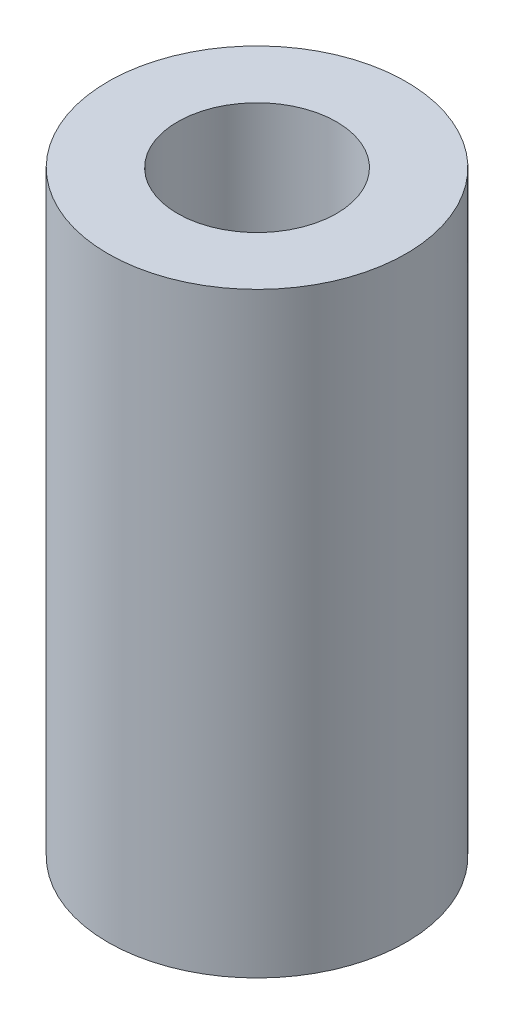
ISO-10303-21;
HEADER;
FILE_DESCRIPTION(('STEP AP214'),'2;1');
FILE_NAME('part.step','',(''),(''),'','','');
FILE_SCHEMA(('AUTOMOTIVE_DESIGN { 1 0 10303 214 1 1 1 1 }'));
ENDSEC;
DATA;
#1=APPLICATION_CONTEXT('core data for automotive mechanical design processes');
#2=APPLICATION_PROTOCOL_DEFINITION('international standard','automotive_design',2000,#1);
#3=PRODUCT_CONTEXT('',#1,'mechanical');
#4=PRODUCT('Part','Part','',(#3));
#5=PRODUCT_RELATED_PRODUCT_CATEGORY('part','',(#4));
#6=PRODUCT_DEFINITION_FORMATION('','',#4);
#7=PRODUCT_DEFINITION_CONTEXT('part definition',#1,'design');
#8=PRODUCT_DEFINITION('design','',#6,#7);
#9=PRODUCT_DEFINITION_SHAPE('','',#8);
#10=(LENGTH_UNIT() NAMED_UNIT(*) SI_UNIT(.MILLI.,.METRE.));
#11=(NAMED_UNIT(*) PLANE_ANGLE_UNIT() SI_UNIT($,.RADIAN.));
#12=(NAMED_UNIT(*) SI_UNIT($,.STERADIAN.) SOLID_ANGLE_UNIT());
#13=UNCERTAINTY_MEASURE_WITH_UNIT(LENGTH_MEASURE(1.E-05),#10,'distance_accuracy_value','');
#14=(GEOMETRIC_REPRESENTATION_CONTEXT(3) GLOBAL_UNCERTAINTY_ASSIGNED_CONTEXT((#13)) GLOBAL_UNIT_ASSIGNED_CONTEXT((#10,
#11,#12)) REPRESENTATION_CONTEXT('',''));
#15=CARTESIAN_POINT('',(0.,0.,0.));
#16=DIRECTION('',(0.,0.,1.));
#17=DIRECTION('',(1.,0.,0.));
#18=AXIS2_PLACEMENT_3D('',#15,#16,#17);
#19=CARTESIAN_POINT('',(0.,30.,0.));
#20=DIRECTION('',(0.,1.,0.));
#21=DIRECTION('',(0.,0.,1.));
#22=AXIS2_PLACEMENT_3D('',#19,#20,#21);
#23=PLANE('',#22);
#24=CARTESIAN_POINT('',(0.,30.,0.));
#25=DIRECTION('',(0.,1.,0.));
#26=DIRECTION('',(0.,0.,1.));
#27=AXIS2_PLACEMENT_3D('',#24,#25,#26);
#28=CIRCLE('',#27,7.5);
#29=CARTESIAN_POINT('',(0.,30.,7.5));
#30=VERTEX_POINT('',#29);
#31=EDGE_CURVE('E123',#30,#30,#28,.T.);
#32=ORIENTED_EDGE('',*,*,#31,.T.);
#33=EDGE_LOOP('',(#32));
#34=FACE_BOUND('',#33,.T.);
#35=CARTESIAN_POINT('',(0.,30.,0.));
#36=DIRECTION('',(0.,1.,0.));
#37=DIRECTION('',(0.,0.,1.));
#38=AXIS2_PLACEMENT_3D('',#35,#36,#37);
#39=CIRCLE('',#38,4.);
#40=CARTESIAN_POINT('',(0.,30.,4.));
#41=VERTEX_POINT('',#40);
#42=EDGE_CURVE('E113',#41,#41,#39,.T.);
#43=ORIENTED_EDGE('',*,*,#42,.F.);
#44=EDGE_LOOP('',(#43));
#45=FACE_BOUND('',#44,.T.);
#46=ADVANCED_FACE('F45',(#34,#45),#23,.T.);
#47=CARTESIAN_POINT('',(0.,0.,0.));
#48=DIRECTION('',(0.,1.,0.));
#49=DIRECTION('',(0.,0.,1.));
#50=AXIS2_PLACEMENT_3D('',#47,#48,#49);
#51=PLANE('',#50);
#52=DIRECTION('',(1.,0.,0.));
#53=VECTOR('',#52,1.);
#54=CARTESIAN_POINT('',(3.45,0.,2.9));
#55=LINE('',#54,#53);
#56=CARTESIAN_POINT('',(-2.75499546279118,0.,2.9));
#57=VERTEX_POINT('',#56);
#58=CARTESIAN_POINT('',(2.75499546279118,0.,2.9));
#59=VERTEX_POINT('',#58);
#60=EDGE_CURVE('E67',#57,#59,#55,.T.);
#61=ORIENTED_EDGE('',*,*,#60,.T.);
#62=CARTESIAN_POINT('',(0.,0.,0.));
#63=DIRECTION('',(0.,1.,0.));
#64=DIRECTION('',(0.,0.,1.));
#65=AXIS2_PLACEMENT_3D('',#62,#63,#64);
#66=CIRCLE('',#65,4.);
#67=EDGE_CURVE('E108',#59,#57,#66,.T.);
#68=ORIENTED_EDGE('',*,*,#67,.T.);
#69=EDGE_LOOP('',(#61,#68));
#70=FACE_BOUND('',#69,.T.);
#71=CARTESIAN_POINT('',(0.,0.,0.));
#72=DIRECTION('',(0.,1.,0.));
#73=DIRECTION('',(0.,0.,1.));
#74=AXIS2_PLACEMENT_3D('',#71,#72,#73);
#75=CIRCLE('',#74,7.5);
#76=CARTESIAN_POINT('',(0.,0.,7.5));
#77=VERTEX_POINT('',#76);
#78=EDGE_CURVE('E121',#77,#77,#75,.T.);
#79=ORIENTED_EDGE('',*,*,#78,.F.);
#80=EDGE_LOOP('',(#79));
#81=FACE_BOUND('',#80,.T.);
#82=ADVANCED_FACE('F143',(#70,#81),#51,.F.);
#83=CARTESIAN_POINT('',(0.,30.,0.));
#84=DIRECTION('',(0.,-1.,0.));
#85=DIRECTION('',(0.,0.,-1.));
#86=AXIS2_PLACEMENT_3D('',#83,#84,#85);
#87=CYLINDRICAL_SURFACE('',#86,7.5);
#88=ORIENTED_EDGE('',*,*,#31,.F.);
#89=EDGE_LOOP('',(#88));
#90=FACE_BOUND('',#89,.T.);
#91=ORIENTED_EDGE('',*,*,#78,.T.);
#92=EDGE_LOOP('',(#91));
#93=FACE_BOUND('',#92,.T.);
#94=ADVANCED_FACE('F47',(#90,#93),#87,.T.);
#95=CARTESIAN_POINT('',(0.,30.,0.));
#96=DIRECTION('',(0.,-1.,0.));
#97=DIRECTION('',(0.,0.,-1.));
#98=AXIS2_PLACEMENT_3D('',#95,#96,#97);
#99=CYLINDRICAL_SURFACE('',#98,4.);
#100=DIRECTION('',(0.,-1.,0.));
#101=VECTOR('',#100,1.);
#102=CARTESIAN_POINT('',(2.75499546279118,30.,2.9));
#103=LINE('',#102,#101);
#104=CARTESIAN_POINT('',(2.75499546279118,20.,2.9));
#105=VERTEX_POINT('',#104);
#106=EDGE_CURVE('E90',#105,#59,#103,.T.);
#107=ORIENTED_EDGE('',*,*,#106,.F.);
#108=CARTESIAN_POINT('',(0.,20.,0.));
#109=DIRECTION('',(0.,1.,0.));
#110=DIRECTION('',(0.,0.,1.));
#111=AXIS2_PLACEMENT_3D('',#108,#109,#110);
#112=CIRCLE('',#111,4.);
#113=CARTESIAN_POINT('',(-2.75499546279118,20.,2.9));
#114=VERTEX_POINT('',#113);
#115=EDGE_CURVE('E127',#114,#105,#112,.T.);
#116=ORIENTED_EDGE('',*,*,#115,.F.);
#117=DIRECTION('',(0.,-1.,0.));
#118=VECTOR('',#117,1.);
#119=CARTESIAN_POINT('',(-2.75499546279118,30.,2.9));
#120=LINE('',#119,#118);
#121=EDGE_CURVE('E103',#57,#114,#120,.F.);
#122=ORIENTED_EDGE('',*,*,#121,.F.);
#123=ORIENTED_EDGE('',*,*,#67,.F.);
#124=EDGE_LOOP('',(#107,#116,#122,#123));
#125=FACE_BOUND('',#124,.T.);
#126=ORIENTED_EDGE('',*,*,#42,.T.);
#127=EDGE_LOOP('',(#126));
#128=FACE_BOUND('',#127,.T.);
#129=ADVANCED_FACE('F141',(#125,#128),#99,.F.);
#130=CARTESIAN_POINT('',(0.,20.,0.));
#131=DIRECTION('',(0.,1.,0.));
#132=DIRECTION('',(0.,0.,1.));
#133=AXIS2_PLACEMENT_3D('',#130,#131,#132);
#134=PLANE('',#133);
#135=CARTESIAN_POINT('',(0.,20.,0.));
#136=DIRECTION('',(0.,1.,0.));
#137=DIRECTION('',(0.,0.,1.));
#138=AXIS2_PLACEMENT_3D('',#135,#136,#137);
#139=CIRCLE('',#138,3.925);
#140=CARTESIAN_POINT('',(-2.64492438455242,20.,2.9));
#141=VERTEX_POINT('',#140);
#142=CARTESIAN_POINT('',(2.64492438455242,20.,2.9));
#143=VERTEX_POINT('',#142);
#144=EDGE_CURVE('E96',#141,#143,#139,.T.);
#145=ORIENTED_EDGE('',*,*,#144,.F.);
#146=DIRECTION('',(1.,0.,0.));
#147=VECTOR('',#146,1.);
#148=CARTESIAN_POINT('',(3.45,20.,2.9));
#149=LINE('',#148,#147);
#150=EDGE_CURVE('E101',#114,#141,#149,.T.);
#151=ORIENTED_EDGE('',*,*,#150,.F.);
#152=ORIENTED_EDGE('',*,*,#115,.T.);
#153=EDGE_CURVE('E109',#143,#105,#149,.T.);
#154=ORIENTED_EDGE('',*,*,#153,.F.);
#155=EDGE_LOOP('',(#145,#151,#152,#154));
#156=FACE_BOUND('',#155,.T.);
#157=ADVANCED_FACE('F154',(#156),#134,.T.);
#158=CARTESIAN_POINT('',(3.45,20.,2.9));
#159=DIRECTION('',(0.,0.,-1.));
#160=DIRECTION('',(-1.,0.,0.));
#161=AXIS2_PLACEMENT_3D('',#158,#159,#160);
#162=PLANE('',#161);
#163=DIRECTION('',(0.,1.,0.));
#164=VECTOR('',#163,1.);
#165=CARTESIAN_POINT('',(-2.64492438455242,9.99999999999998,2.9));
#166=LINE('',#165,#164);
#167=CARTESIAN_POINT('',(-2.64492438455242,9.99999999999998,2.9));
#168=VERTEX_POINT('',#167);
#169=EDGE_CURVE('E11',#168,#141,#166,.T.);
#170=ORIENTED_EDGE('',*,*,#169,.F.);
#171=DIRECTION('',(1.,0.,0.));
#172=VECTOR('',#171,1.);
#173=CARTESIAN_POINT('',(3.45,9.99999999999998,2.9));
#174=LINE('',#173,#172);
#175=CARTESIAN_POINT('',(2.64492438455242,9.99999999999998,2.9));
#176=VERTEX_POINT('',#175);
#177=EDGE_CURVE('E84',#168,#176,#174,.T.);
#178=ORIENTED_EDGE('',*,*,#177,.T.);
#179=DIRECTION('',(0.,1.,0.));
#180=VECTOR('',#179,1.);
#181=CARTESIAN_POINT('',(2.64492438455242,9.99999999999998,2.9));
#182=LINE('',#181,#180);
#183=EDGE_CURVE('E54',#143,#176,#182,.F.);
#184=ORIENTED_EDGE('',*,*,#183,.F.);
#185=ORIENTED_EDGE('',*,*,#153,.T.);
#186=ORIENTED_EDGE('',*,*,#106,.T.);
#187=ORIENTED_EDGE('',*,*,#60,.F.);
#188=ORIENTED_EDGE('',*,*,#121,.T.);
#189=ORIENTED_EDGE('',*,*,#150,.T.);
#190=EDGE_LOOP('',(#170,#178,#184,#185,#186,#187,#188,#189));
#191=FACE_BOUND('',#190,.T.);
#192=ADVANCED_FACE('F99',(#191),#162,.T.);
#193=CARTESIAN_POINT('',(0.,9.99999999999998,0.));
#194=DIRECTION('',(0.,1.,0.));
#195=DIRECTION('',(0.,0.,1.));
#196=AXIS2_PLACEMENT_3D('',#193,#194,#195);
#197=CYLINDRICAL_SURFACE('',#196,3.925);
#198=ORIENTED_EDGE('',*,*,#169,.T.);
#199=ORIENTED_EDGE('',*,*,#144,.T.);
#200=ORIENTED_EDGE('',*,*,#183,.T.);
#201=CARTESIAN_POINT('',(0.,9.99999999999998,0.));
#202=DIRECTION('',(0.,1.,0.));
#203=DIRECTION('',(0.,0.,1.));
#204=AXIS2_PLACEMENT_3D('',#201,#202,#203);
#205=CIRCLE('',#204,3.925);
#206=EDGE_CURVE('E60',#168,#176,#205,.T.);
#207=ORIENTED_EDGE('',*,*,#206,.F.);
#208=EDGE_LOOP('',(#198,#199,#200,#207));
#209=FACE_BOUND('',#208,.T.);
#210=ADVANCED_FACE('F93',(#209),#197,.F.);
#211=CARTESIAN_POINT('',(0.,9.99999999999998,0.));
#212=DIRECTION('',(0.,1.,0.));
#213=DIRECTION('',(0.,0.,1.));
#214=AXIS2_PLACEMENT_3D('',#211,#212,#213);
#215=PLANE('',#214);
#216=ORIENTED_EDGE('',*,*,#206,.T.);
#217=ORIENTED_EDGE('',*,*,#177,.F.);
#218=EDGE_LOOP('',(#216,#217));
#219=FACE_BOUND('',#218,.T.);
#220=ADVANCED_FACE('F85',(#219),#215,.T.);
#221=CLOSED_SHELL('',(#46,#82,#94,#129,#157,#192,#210,#220));
#222=MANIFOLD_SOLID_BREP('B2',#221);
#223=ADVANCED_BREP_SHAPE_REPRESENTATION('',(#18,#222),#14);
#224=SHAPE_DEFINITION_REPRESENTATION(#9,#223);
ENDSEC;
END-ISO-10303-21;
